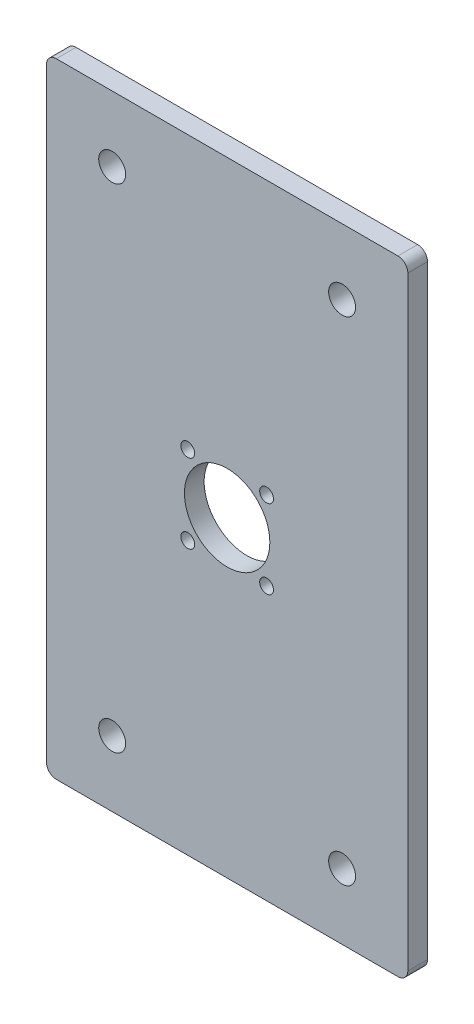
ISO-10303-21;
HEADER;
FILE_DESCRIPTION(('STEP AP214'),'2;1');
FILE_NAME('part.step','',(''),(''),'','','');
FILE_SCHEMA(('AUTOMOTIVE_DESIGN { 1 0 10303 214 1 1 1 1 }'));
ENDSEC;
DATA;
#1=APPLICATION_CONTEXT('core data for automotive mechanical design processes');
#2=APPLICATION_PROTOCOL_DEFINITION('international standard','automotive_design',2000,#1);
#3=PRODUCT_CONTEXT('',#1,'mechanical');
#4=PRODUCT('Part','Part','',(#3));
#5=PRODUCT_RELATED_PRODUCT_CATEGORY('part','',(#4));
#6=PRODUCT_DEFINITION_FORMATION('','',#4);
#7=PRODUCT_DEFINITION_CONTEXT('part definition',#1,'design');
#8=PRODUCT_DEFINITION('design','',#6,#7);
#9=PRODUCT_DEFINITION_SHAPE('','',#8);
#10=(LENGTH_UNIT() NAMED_UNIT(*) SI_UNIT(.MILLI.,.METRE.));
#11=(NAMED_UNIT(*) PLANE_ANGLE_UNIT() SI_UNIT($,.RADIAN.));
#12=(NAMED_UNIT(*) SI_UNIT($,.STERADIAN.) SOLID_ANGLE_UNIT());
#13=UNCERTAINTY_MEASURE_WITH_UNIT(LENGTH_MEASURE(1.E-05),#10,'distance_accuracy_value','');
#14=(GEOMETRIC_REPRESENTATION_CONTEXT(3) GLOBAL_UNCERTAINTY_ASSIGNED_CONTEXT((#13)) GLOBAL_UNIT_ASSIGNED_CONTEXT((#10,
#11,#12)) REPRESENTATION_CONTEXT('',''));
#15=CARTESIAN_POINT('',(0.,0.,0.));
#16=DIRECTION('',(0.,0.,1.));
#17=DIRECTION('',(1.,0.,0.));
#18=AXIS2_PLACEMENT_3D('',#15,#16,#17);
#19=CARTESIAN_POINT('',(55.,95.,6.));
#20=DIRECTION('',(-1.,0.,0.));
#21=DIRECTION('',(0.,-1.,0.));
#22=AXIS2_PLACEMENT_3D('',#19,#20,#21);
#23=PLANE('',#22);
#24=DIRECTION('',(0.,1.,0.));
#25=VECTOR('',#24,1.);
#26=CARTESIAN_POINT('',(55.,95.,6.));
#27=LINE('',#26,#25);
#28=CARTESIAN_POINT('',(55.,-92.,6.));
#29=VERTEX_POINT('',#28);
#30=CARTESIAN_POINT('',(55.,92.,6.));
#31=VERTEX_POINT('',#30);
#32=EDGE_CURVE('E130',#29,#31,#27,.T.);
#33=ORIENTED_EDGE('',*,*,#32,.F.);
#34=DIRECTION('',(0.,0.,-1.));
#35=VECTOR('',#34,1.);
#36=CARTESIAN_POINT('',(55.,-92.,6.));
#37=LINE('',#36,#35);
#38=CARTESIAN_POINT('',(55.,-92.,0.));
#39=VERTEX_POINT('',#38);
#40=EDGE_CURVE('E157',#29,#39,#37,.T.);
#41=ORIENTED_EDGE('',*,*,#40,.T.);
#42=DIRECTION('',(0.,1.,0.));
#43=VECTOR('',#42,1.);
#44=CARTESIAN_POINT('',(55.,95.,0.));
#45=LINE('',#44,#43);
#46=CARTESIAN_POINT('',(55.,92.,0.));
#47=VERTEX_POINT('',#46);
#48=EDGE_CURVE('E219',#39,#47,#45,.T.);
#49=ORIENTED_EDGE('',*,*,#48,.T.);
#50=DIRECTION('',(0.,0.,-1.));
#51=VECTOR('',#50,1.);
#52=CARTESIAN_POINT('',(55.,92.,6.));
#53=LINE('',#52,#51);
#54=EDGE_CURVE('E155',#47,#31,#53,.F.);
#55=ORIENTED_EDGE('',*,*,#54,.T.);
#56=EDGE_LOOP('',(#33,#41,#49,#55));
#57=FACE_BOUND('',#56,.T.);
#58=ADVANCED_FACE('F36',(#57),#23,.F.);
#59=CARTESIAN_POINT('',(-55.,95.,6.));
#60=DIRECTION('',(0.,-1.,0.));
#61=DIRECTION('',(0.,0.,-1.));
#62=AXIS2_PLACEMENT_3D('',#59,#60,#61);
#63=PLANE('',#62);
#64=DIRECTION('',(-1.,0.,0.));
#65=VECTOR('',#64,1.);
#66=CARTESIAN_POINT('',(-55.,95.,6.));
#67=LINE('',#66,#65);
#68=CARTESIAN_POINT('',(52.,95.,6.));
#69=VERTEX_POINT('',#68);
#70=CARTESIAN_POINT('',(-52.,95.,6.));
#71=VERTEX_POINT('',#70);
#72=EDGE_CURVE('E133',#69,#71,#67,.T.);
#73=ORIENTED_EDGE('',*,*,#72,.F.);
#74=DIRECTION('',(0.,0.,-1.));
#75=VECTOR('',#74,1.);
#76=CARTESIAN_POINT('',(52.,95.,6.));
#77=LINE('',#76,#75);
#78=CARTESIAN_POINT('',(52.,95.,0.));
#79=VERTEX_POINT('',#78);
#80=EDGE_CURVE('E11',#69,#79,#77,.T.);
#81=ORIENTED_EDGE('',*,*,#80,.T.);
#82=DIRECTION('',(-1.,0.,0.));
#83=VECTOR('',#82,1.);
#84=CARTESIAN_POINT('',(-55.,95.,0.));
#85=LINE('',#84,#83);
#86=CARTESIAN_POINT('',(-52.,95.,0.));
#87=VERTEX_POINT('',#86);
#88=EDGE_CURVE('E136',#79,#87,#85,.T.);
#89=ORIENTED_EDGE('',*,*,#88,.T.);
#90=DIRECTION('',(0.,0.,-1.));
#91=VECTOR('',#90,1.);
#92=CARTESIAN_POINT('',(-52.,95.,6.));
#93=LINE('',#92,#91);
#94=EDGE_CURVE('E45',#87,#71,#93,.F.);
#95=ORIENTED_EDGE('',*,*,#94,.T.);
#96=EDGE_LOOP('',(#73,#81,#89,#95));
#97=FACE_BOUND('',#96,.T.);
#98=ADVANCED_FACE('F229',(#97),#63,.F.);
#99=CARTESIAN_POINT('',(-55.,95.,6.));
#100=DIRECTION('',(1.,0.,0.));
#101=DIRECTION('',(0.,1.,0.));
#102=AXIS2_PLACEMENT_3D('',#99,#100,#101);
#103=PLANE('',#102);
#104=DIRECTION('',(0.,-1.,0.));
#105=VECTOR('',#104,1.);
#106=CARTESIAN_POINT('',(-55.,95.,0.));
#107=LINE('',#106,#105);
#108=CARTESIAN_POINT('',(-55.,92.,0.));
#109=VERTEX_POINT('',#108);
#110=CARTESIAN_POINT('',(-55.,-92.,0.));
#111=VERTEX_POINT('',#110);
#112=EDGE_CURVE('E131',#109,#111,#107,.T.);
#113=ORIENTED_EDGE('',*,*,#112,.T.);
#114=DIRECTION('',(0.,0.,-1.));
#115=VECTOR('',#114,1.);
#116=CARTESIAN_POINT('',(-55.,-92.,6.));
#117=LINE('',#116,#115);
#118=CARTESIAN_POINT('',(-55.,-92.,6.));
#119=VERTEX_POINT('',#118);
#120=EDGE_CURVE('E109',#111,#119,#117,.F.);
#121=ORIENTED_EDGE('',*,*,#120,.T.);
#122=DIRECTION('',(0.,-1.,0.));
#123=VECTOR('',#122,1.);
#124=CARTESIAN_POINT('',(-55.,95.,6.));
#125=LINE('',#124,#123);
#126=CARTESIAN_POINT('',(-55.,92.,6.));
#127=VERTEX_POINT('',#126);
#128=EDGE_CURVE('E222',#127,#119,#125,.T.);
#129=ORIENTED_EDGE('',*,*,#128,.F.);
#130=DIRECTION('',(0.,0.,-1.));
#131=VECTOR('',#130,1.);
#132=CARTESIAN_POINT('',(-55.,92.,6.));
#133=LINE('',#132,#131);
#134=EDGE_CURVE('E114',#127,#109,#133,.T.);
#135=ORIENTED_EDGE('',*,*,#134,.T.);
#136=EDGE_LOOP('',(#113,#121,#129,#135));
#137=FACE_BOUND('',#136,.T.);
#138=ADVANCED_FACE('F237',(#137),#103,.F.);
#139=CARTESIAN_POINT('',(-55.,-95.,6.));
#140=DIRECTION('',(0.,1.,0.));
#141=DIRECTION('',(0.,0.,1.));
#142=AXIS2_PLACEMENT_3D('',#139,#140,#141);
#143=PLANE('',#142);
#144=DIRECTION('',(1.,0.,0.));
#145=VECTOR('',#144,1.);
#146=CARTESIAN_POINT('',(-55.,-95.,6.));
#147=LINE('',#146,#145);
#148=CARTESIAN_POINT('',(-52.,-95.,6.));
#149=VERTEX_POINT('',#148);
#150=CARTESIAN_POINT('',(52.,-95.,6.));
#151=VERTEX_POINT('',#150);
#152=EDGE_CURVE('E124',#149,#151,#147,.T.);
#153=ORIENTED_EDGE('',*,*,#152,.F.);
#154=DIRECTION('',(0.,0.,-1.));
#155=VECTOR('',#154,1.);
#156=CARTESIAN_POINT('',(-52.,-95.,6.));
#157=LINE('',#156,#155);
#158=CARTESIAN_POINT('',(-52.,-95.,0.));
#159=VERTEX_POINT('',#158);
#160=EDGE_CURVE('E108',#149,#159,#157,.T.);
#161=ORIENTED_EDGE('',*,*,#160,.T.);
#162=DIRECTION('',(1.,0.,0.));
#163=VECTOR('',#162,1.);
#164=CARTESIAN_POINT('',(-55.,-95.,0.));
#165=LINE('',#164,#163);
#166=CARTESIAN_POINT('',(52.,-95.,0.));
#167=VERTEX_POINT('',#166);
#168=EDGE_CURVE('E121',#159,#167,#165,.T.);
#169=ORIENTED_EDGE('',*,*,#168,.T.);
#170=DIRECTION('',(0.,0.,-1.));
#171=VECTOR('',#170,1.);
#172=CARTESIAN_POINT('',(52.,-95.,6.));
#173=LINE('',#172,#171);
#174=EDGE_CURVE('E126',#167,#151,#173,.F.);
#175=ORIENTED_EDGE('',*,*,#174,.T.);
#176=EDGE_LOOP('',(#153,#161,#169,#175));
#177=FACE_BOUND('',#176,.T.);
#178=ADVANCED_FACE('F120',(#177),#143,.F.);
#179=CARTESIAN_POINT('',(0.,0.,6.));
#180=DIRECTION('',(0.,0.,1.));
#181=DIRECTION('',(1.,0.,0.));
#182=AXIS2_PLACEMENT_3D('',#179,#180,#181);
#183=PLANE('',#182);
#184=CARTESIAN_POINT('',(-12.,12.,6.));
#185=DIRECTION('',(0.,0.,1.));
#186=DIRECTION('',(1.,0.,0.));
#187=AXIS2_PLACEMENT_3D('',#184,#185,#186);
#188=CIRCLE('',#187,2.09999999999999);
#189=CARTESIAN_POINT('',(-9.90000000000002,12.,6.));
#190=VERTEX_POINT('',#189);
#191=EDGE_CURVE('E179',#190,#190,#188,.T.);
#192=ORIENTED_EDGE('',*,*,#191,.F.);
#193=EDGE_LOOP('',(#192));
#194=FACE_BOUND('',#193,.T.);
#195=CARTESIAN_POINT('',(12.,12.,6.));
#196=DIRECTION('',(0.,0.,1.));
#197=DIRECTION('',(1.,0.,0.));
#198=AXIS2_PLACEMENT_3D('',#195,#196,#197);
#199=CIRCLE('',#198,2.09999999999999);
#200=CARTESIAN_POINT('',(14.1,12.,6.));
#201=VERTEX_POINT('',#200);
#202=EDGE_CURVE('E168',#201,#201,#199,.T.);
#203=ORIENTED_EDGE('',*,*,#202,.F.);
#204=EDGE_LOOP('',(#203));
#205=FACE_BOUND('',#204,.T.);
#206=CARTESIAN_POINT('',(12.,-12.,6.));
#207=DIRECTION('',(0.,0.,1.));
#208=DIRECTION('',(1.,0.,0.));
#209=AXIS2_PLACEMENT_3D('',#206,#207,#208);
#210=CIRCLE('',#209,2.09999999999999);
#211=CARTESIAN_POINT('',(14.1,-12.,6.));
#212=VERTEX_POINT('',#211);
#213=EDGE_CURVE('E167',#212,#212,#210,.T.);
#214=ORIENTED_EDGE('',*,*,#213,.F.);
#215=EDGE_LOOP('',(#214));
#216=FACE_BOUND('',#215,.T.);
#217=CARTESIAN_POINT('',(-12.,-12.,6.));
#218=DIRECTION('',(0.,0.,1.));
#219=DIRECTION('',(1.,0.,0.));
#220=AXIS2_PLACEMENT_3D('',#217,#218,#219);
#221=CIRCLE('',#220,2.09999999999999);
#222=CARTESIAN_POINT('',(-9.90000000000001,-12.,6.));
#223=VERTEX_POINT('',#222);
#224=EDGE_CURVE('E164',#223,#223,#221,.T.);
#225=ORIENTED_EDGE('',*,*,#224,.F.);
#226=EDGE_LOOP('',(#225));
#227=FACE_BOUND('',#226,.T.);
#228=CARTESIAN_POINT('',(-35.,-75.,6.));
#229=DIRECTION('',(0.,0.,1.));
#230=DIRECTION('',(1.,0.,0.));
#231=AXIS2_PLACEMENT_3D('',#228,#229,#230);
#232=CIRCLE('',#231,4.10000000000001);
#233=CARTESIAN_POINT('',(-30.9,-75.,6.));
#234=VERTEX_POINT('',#233);
#235=EDGE_CURVE('E163',#234,#234,#232,.T.);
#236=ORIENTED_EDGE('',*,*,#235,.F.);
#237=EDGE_LOOP('',(#236));
#238=FACE_BOUND('',#237,.T.);
#239=CARTESIAN_POINT('',(35.,-75.,6.));
#240=DIRECTION('',(0.,0.,1.));
#241=DIRECTION('',(1.,0.,0.));
#242=AXIS2_PLACEMENT_3D('',#239,#240,#241);
#243=CIRCLE('',#242,4.1);
#244=CARTESIAN_POINT('',(39.1,-75.,6.));
#245=VERTEX_POINT('',#244);
#246=EDGE_CURVE('E195',#245,#245,#243,.T.);
#247=ORIENTED_EDGE('',*,*,#246,.F.);
#248=EDGE_LOOP('',(#247));
#249=FACE_BOUND('',#248,.T.);
#250=CARTESIAN_POINT('',(35.,75.,6.));
#251=DIRECTION('',(0.,0.,1.));
#252=DIRECTION('',(1.,0.,0.));
#253=AXIS2_PLACEMENT_3D('',#250,#251,#252);
#254=CIRCLE('',#253,4.1);
#255=CARTESIAN_POINT('',(39.1,75.,6.));
#256=VERTEX_POINT('',#255);
#257=EDGE_CURVE('E186',#256,#256,#254,.T.);
#258=ORIENTED_EDGE('',*,*,#257,.F.);
#259=EDGE_LOOP('',(#258));
#260=FACE_BOUND('',#259,.T.);
#261=CARTESIAN_POINT('',(-35.,75.,6.));
#262=DIRECTION('',(0.,0.,1.));
#263=DIRECTION('',(1.,0.,0.));
#264=AXIS2_PLACEMENT_3D('',#261,#262,#263);
#265=CIRCLE('',#264,4.10000000000001);
#266=CARTESIAN_POINT('',(-30.9,75.,6.));
#267=VERTEX_POINT('',#266);
#268=EDGE_CURVE('E194',#267,#267,#265,.T.);
#269=ORIENTED_EDGE('',*,*,#268,.F.);
#270=EDGE_LOOP('',(#269));
#271=FACE_BOUND('',#270,.T.);
#272=CARTESIAN_POINT('',(0.,0.,6.));
#273=DIRECTION('',(0.,0.,1.));
#274=DIRECTION('',(1.,0.,0.));
#275=AXIS2_PLACEMENT_3D('',#272,#273,#274);
#276=CIRCLE('',#275,13.);
#277=CARTESIAN_POINT('',(13.,0.,6.));
#278=VERTEX_POINT('',#277);
#279=EDGE_CURVE('E213',#278,#278,#276,.T.);
#280=ORIENTED_EDGE('',*,*,#279,.F.);
#281=EDGE_LOOP('',(#280));
#282=FACE_BOUND('',#281,.T.);
#283=ORIENTED_EDGE('',*,*,#128,.T.);
#284=CARTESIAN_POINT('',(-52.,-92.,6.));
#285=DIRECTION('',(0.,0.,1.));
#286=DIRECTION('',(1.,0.,0.));
#287=AXIS2_PLACEMENT_3D('',#284,#285,#286);
#288=CIRCLE('',#287,3.);
#289=EDGE_CURVE('E153',#119,#149,#288,.T.);
#290=ORIENTED_EDGE('',*,*,#289,.T.);
#291=ORIENTED_EDGE('',*,*,#152,.T.);
#292=CARTESIAN_POINT('',(52.,-92.,6.));
#293=DIRECTION('',(0.,0.,1.));
#294=DIRECTION('',(1.,0.,0.));
#295=AXIS2_PLACEMENT_3D('',#292,#293,#294);
#296=CIRCLE('',#295,3.);
#297=EDGE_CURVE('E151',#151,#29,#296,.T.);
#298=ORIENTED_EDGE('',*,*,#297,.T.);
#299=ORIENTED_EDGE('',*,*,#32,.T.);
#300=CARTESIAN_POINT('',(52.,92.,6.));
#301=DIRECTION('',(0.,0.,1.));
#302=DIRECTION('',(1.,0.,0.));
#303=AXIS2_PLACEMENT_3D('',#300,#301,#302);
#304=CIRCLE('',#303,3.);
#305=EDGE_CURVE('E59',#31,#69,#304,.T.);
#306=ORIENTED_EDGE('',*,*,#305,.T.);
#307=ORIENTED_EDGE('',*,*,#72,.T.);
#308=CARTESIAN_POINT('',(-52.,92.,6.));
#309=DIRECTION('',(0.,0.,1.));
#310=DIRECTION('',(1.,0.,0.));
#311=AXIS2_PLACEMENT_3D('',#308,#309,#310);
#312=CIRCLE('',#311,3.);
#313=EDGE_CURVE('E148',#71,#127,#312,.T.);
#314=ORIENTED_EDGE('',*,*,#313,.T.);
#315=EDGE_LOOP('',(#283,#290,#291,#298,#299,#306,#307,#314));
#316=FACE_BOUND('',#315,.T.);
#317=ADVANCED_FACE('F235',(#194,#205,#216,#227,#238,#249,#260,#271,#282,#316),#183,.T.);
#318=CARTESIAN_POINT('',(0.,0.,0.));
#319=DIRECTION('',(0.,0.,1.));
#320=DIRECTION('',(1.,0.,0.));
#321=AXIS2_PLACEMENT_3D('',#318,#319,#320);
#322=PLANE('',#321);
#323=CARTESIAN_POINT('',(-12.,12.,0.));
#324=DIRECTION('',(0.,0.,1.));
#325=DIRECTION('',(1.,0.,0.));
#326=AXIS2_PLACEMENT_3D('',#323,#324,#325);
#327=CIRCLE('',#326,2.09999999999999);
#328=CARTESIAN_POINT('',(-9.90000000000002,12.,0.));
#329=VERTEX_POINT('',#328);
#330=EDGE_CURVE('E40',#329,#329,#327,.T.);
#331=ORIENTED_EDGE('',*,*,#330,.T.);
#332=EDGE_LOOP('',(#331));
#333=FACE_BOUND('',#332,.T.);
#334=CARTESIAN_POINT('',(12.,12.,0.));
#335=DIRECTION('',(0.,0.,1.));
#336=DIRECTION('',(1.,0.,0.));
#337=AXIS2_PLACEMENT_3D('',#334,#335,#336);
#338=CIRCLE('',#337,2.09999999999999);
#339=CARTESIAN_POINT('',(14.1,12.,0.));
#340=VERTEX_POINT('',#339);
#341=EDGE_CURVE('E165',#340,#340,#338,.T.);
#342=ORIENTED_EDGE('',*,*,#341,.T.);
#343=EDGE_LOOP('',(#342));
#344=FACE_BOUND('',#343,.T.);
#345=CARTESIAN_POINT('',(12.,-12.,0.));
#346=DIRECTION('',(0.,0.,1.));
#347=DIRECTION('',(1.,0.,0.));
#348=AXIS2_PLACEMENT_3D('',#345,#346,#347);
#349=CIRCLE('',#348,2.09999999999999);
#350=CARTESIAN_POINT('',(14.1,-12.,0.));
#351=VERTEX_POINT('',#350);
#352=EDGE_CURVE('E172',#351,#351,#349,.T.);
#353=ORIENTED_EDGE('',*,*,#352,.T.);
#354=EDGE_LOOP('',(#353));
#355=FACE_BOUND('',#354,.T.);
#356=CARTESIAN_POINT('',(-12.,-12.,0.));
#357=DIRECTION('',(0.,0.,1.));
#358=DIRECTION('',(1.,0.,0.));
#359=AXIS2_PLACEMENT_3D('',#356,#357,#358);
#360=CIRCLE('',#359,2.09999999999999);
#361=CARTESIAN_POINT('',(-9.90000000000001,-12.,0.));
#362=VERTEX_POINT('',#361);
#363=EDGE_CURVE('E161',#362,#362,#360,.T.);
#364=ORIENTED_EDGE('',*,*,#363,.T.);
#365=EDGE_LOOP('',(#364));
#366=FACE_BOUND('',#365,.T.);
#367=CARTESIAN_POINT('',(-35.,-75.,0.));
#368=DIRECTION('',(0.,0.,1.));
#369=DIRECTION('',(1.,0.,0.));
#370=AXIS2_PLACEMENT_3D('',#367,#368,#369);
#371=CIRCLE('',#370,4.10000000000001);
#372=CARTESIAN_POINT('',(-30.9,-75.,0.));
#373=VERTEX_POINT('',#372);
#374=EDGE_CURVE('E198',#373,#373,#371,.F.);
#375=ORIENTED_EDGE('',*,*,#374,.F.);
#376=EDGE_LOOP('',(#375));
#377=FACE_BOUND('',#376,.T.);
#378=CARTESIAN_POINT('',(35.,-75.,0.));
#379=DIRECTION('',(0.,0.,1.));
#380=DIRECTION('',(1.,0.,0.));
#381=AXIS2_PLACEMENT_3D('',#378,#379,#380);
#382=CIRCLE('',#381,4.1);
#383=CARTESIAN_POINT('',(39.1,-75.,0.));
#384=VERTEX_POINT('',#383);
#385=EDGE_CURVE('E190',#384,#384,#382,.F.);
#386=ORIENTED_EDGE('',*,*,#385,.F.);
#387=EDGE_LOOP('',(#386));
#388=FACE_BOUND('',#387,.T.);
#389=CARTESIAN_POINT('',(35.,75.,0.));
#390=DIRECTION('',(0.,0.,1.));
#391=DIRECTION('',(1.,0.,0.));
#392=AXIS2_PLACEMENT_3D('',#389,#390,#391);
#393=CIRCLE('',#392,4.1);
#394=CARTESIAN_POINT('',(39.1,75.,0.));
#395=VERTEX_POINT('',#394);
#396=EDGE_CURVE('E189',#395,#395,#393,.F.);
#397=ORIENTED_EDGE('',*,*,#396,.F.);
#398=EDGE_LOOP('',(#397));
#399=FACE_BOUND('',#398,.T.);
#400=CARTESIAN_POINT('',(-35.,75.,0.));
#401=DIRECTION('',(0.,0.,1.));
#402=DIRECTION('',(1.,0.,0.));
#403=AXIS2_PLACEMENT_3D('',#400,#401,#402);
#404=CIRCLE('',#403,4.10000000000001);
#405=CARTESIAN_POINT('',(-30.9,75.,0.));
#406=VERTEX_POINT('',#405);
#407=EDGE_CURVE('E209',#406,#406,#404,.F.);
#408=ORIENTED_EDGE('',*,*,#407,.F.);
#409=EDGE_LOOP('',(#408));
#410=FACE_BOUND('',#409,.T.);
#411=CARTESIAN_POINT('',(0.,0.,0.));
#412=DIRECTION('',(0.,0.,1.));
#413=DIRECTION('',(1.,0.,0.));
#414=AXIS2_PLACEMENT_3D('',#411,#412,#413);
#415=CIRCLE('',#414,13.);
#416=CARTESIAN_POINT('',(13.,0.,0.));
#417=VERTEX_POINT('',#416);
#418=EDGE_CURVE('E216',#417,#417,#415,.F.);
#419=ORIENTED_EDGE('',*,*,#418,.F.);
#420=EDGE_LOOP('',(#419));
#421=FACE_BOUND('',#420,.T.);
#422=ORIENTED_EDGE('',*,*,#168,.F.);
#423=CARTESIAN_POINT('',(-52.,-92.,0.));
#424=DIRECTION('',(0.,0.,1.));
#425=DIRECTION('',(1.,0.,0.));
#426=AXIS2_PLACEMENT_3D('',#423,#424,#425);
#427=CIRCLE('',#426,3.);
#428=EDGE_CURVE('E104',#159,#111,#427,.F.);
#429=ORIENTED_EDGE('',*,*,#428,.T.);
#430=ORIENTED_EDGE('',*,*,#112,.F.);
#431=CARTESIAN_POINT('',(-52.,92.,0.));
#432=DIRECTION('',(0.,0.,1.));
#433=DIRECTION('',(1.,0.,0.));
#434=AXIS2_PLACEMENT_3D('',#431,#432,#433);
#435=CIRCLE('',#434,3.);
#436=EDGE_CURVE('E125',#109,#87,#435,.F.);
#437=ORIENTED_EDGE('',*,*,#436,.T.);
#438=ORIENTED_EDGE('',*,*,#88,.F.);
#439=CARTESIAN_POINT('',(52.,92.,0.));
#440=DIRECTION('',(0.,0.,1.));
#441=DIRECTION('',(1.,0.,0.));
#442=AXIS2_PLACEMENT_3D('',#439,#440,#441);
#443=CIRCLE('',#442,3.);
#444=EDGE_CURVE('E142',#79,#47,#443,.F.);
#445=ORIENTED_EDGE('',*,*,#444,.T.);
#446=ORIENTED_EDGE('',*,*,#48,.F.);
#447=CARTESIAN_POINT('',(52.,-92.,0.));
#448=DIRECTION('',(0.,0.,1.));
#449=DIRECTION('',(1.,0.,0.));
#450=AXIS2_PLACEMENT_3D('',#447,#448,#449);
#451=CIRCLE('',#450,3.);
#452=EDGE_CURVE('E115',#39,#167,#451,.F.);
#453=ORIENTED_EDGE('',*,*,#452,.T.);
#454=EDGE_LOOP('',(#422,#429,#430,#437,#438,#445,#446,#453));
#455=FACE_BOUND('',#454,.T.);
#456=ADVANCED_FACE('F128',(#333,#344,#355,#366,#377,#388,#399,#410,#421,#455),#322,.F.);
#457=CARTESIAN_POINT('',(0.,0.,-0.00100000000000013));
#458=DIRECTION('',(0.,0.,1.));
#459=DIRECTION('',(1.,0.,0.));
#460=AXIS2_PLACEMENT_3D('',#457,#458,#459);
#461=CYLINDRICAL_SURFACE('',#460,13.);
#462=CARTESIAN_POINT('',(13.,0.,6.));
#463=CARTESIAN_POINT('',(13.,0.,5.9375));
#464=CARTESIAN_POINT('',(13.,0.,5.875));
#465=CARTESIAN_POINT('',(13.,0.,5.75));
#466=CARTESIAN_POINT('',(13.,0.,5.6875));
#467=CARTESIAN_POINT('',(13.,0.,5.5625));
#468=CARTESIAN_POINT('',(13.,0.,5.5));
#469=CARTESIAN_POINT('',(13.,0.,5.375));
#470=CARTESIAN_POINT('',(13.,0.,5.3125));
#471=CARTESIAN_POINT('',(13.,0.,5.1875));
#472=CARTESIAN_POINT('',(13.,0.,5.125));
#473=CARTESIAN_POINT('',(13.,0.,5.));
#474=CARTESIAN_POINT('',(13.,0.,4.9375));
#475=CARTESIAN_POINT('',(13.,0.,4.8125));
#476=CARTESIAN_POINT('',(13.,0.,4.75));
#477=CARTESIAN_POINT('',(13.,0.,4.625));
#478=CARTESIAN_POINT('',(13.,0.,4.5625));
#479=CARTESIAN_POINT('',(13.,0.,4.4375));
#480=CARTESIAN_POINT('',(13.,0.,4.375));
#481=CARTESIAN_POINT('',(13.,0.,4.25));
#482=CARTESIAN_POINT('',(13.,0.,4.1875));
#483=CARTESIAN_POINT('',(13.,0.,4.0625));
#484=CARTESIAN_POINT('',(13.,0.,4.));
#485=CARTESIAN_POINT('',(13.,0.,3.875));
#486=CARTESIAN_POINT('',(13.,0.,3.8125));
#487=CARTESIAN_POINT('',(13.,0.,3.6875));
#488=CARTESIAN_POINT('',(13.,0.,3.625));
#489=CARTESIAN_POINT('',(13.,0.,3.5));
#490=CARTESIAN_POINT('',(13.,0.,3.4375));
#491=CARTESIAN_POINT('',(13.,0.,3.3125));
#492=CARTESIAN_POINT('',(13.,0.,3.25));
#493=CARTESIAN_POINT('',(13.,0.,3.125));
#494=CARTESIAN_POINT('',(13.,0.,3.0625));
#495=CARTESIAN_POINT('',(13.,0.,2.9375));
#496=CARTESIAN_POINT('',(13.,0.,2.875));
#497=CARTESIAN_POINT('',(13.,0.,2.75));
#498=CARTESIAN_POINT('',(13.,0.,2.6875));
#499=CARTESIAN_POINT('',(13.,0.,2.5625));
#500=CARTESIAN_POINT('',(13.,0.,2.5));
#501=CARTESIAN_POINT('',(13.,0.,2.375));
#502=CARTESIAN_POINT('',(13.,0.,2.3125));
#503=CARTESIAN_POINT('',(13.,0.,2.1875));
#504=CARTESIAN_POINT('',(13.,0.,2.125));
#505=CARTESIAN_POINT('',(13.,0.,2.));
#506=CARTESIAN_POINT('',(13.,0.,1.9375));
#507=CARTESIAN_POINT('',(13.,0.,1.8125));
#508=CARTESIAN_POINT('',(13.,0.,1.75));
#509=CARTESIAN_POINT('',(13.,0.,1.625));
#510=CARTESIAN_POINT('',(13.,0.,1.5625));
#511=CARTESIAN_POINT('',(13.,0.,1.4375));
#512=CARTESIAN_POINT('',(13.,0.,1.375));
#513=CARTESIAN_POINT('',(13.,0.,1.25));
#514=CARTESIAN_POINT('',(13.,0.,1.1875));
#515=CARTESIAN_POINT('',(13.,0.,1.0625));
#516=CARTESIAN_POINT('',(13.,0.,1.));
#517=CARTESIAN_POINT('',(13.,0.,0.875));
#518=CARTESIAN_POINT('',(13.,0.,0.8125));
#519=CARTESIAN_POINT('',(13.,0.,0.6875));
#520=CARTESIAN_POINT('',(13.,0.,0.625));
#521=CARTESIAN_POINT('',(13.,0.,0.5));
#522=CARTESIAN_POINT('',(13.,0.,0.4375));
#523=CARTESIAN_POINT('',(13.,0.,0.3125));
#524=CARTESIAN_POINT('',(13.,0.,0.25));
#525=CARTESIAN_POINT('',(13.,0.,0.125));
#526=CARTESIAN_POINT('',(13.,0.,0.0625000000000001));
#527=CARTESIAN_POINT('',(13.,0.,0.));
#528=B_SPLINE_CURVE_WITH_KNOTS('',3,(#462,#463,#464,#465,#466,#467,#468,#469,#470,#471,#472,
#473,#474,#475,#476,#477,#478,#479,#480,#481,#482,#483,#484,#485,#486,#487,#488,#489,#490,#491,
#492,#493,#494,#495,#496,#497,#498,#499,#500,#501,#502,#503,#504,#505,#506,#507,#508,#509,#510,
#511,#512,#513,#514,#515,#516,#517,#518,#519,#520,#521,#522,#523,#524,#525,#526,#527),
.UNSPECIFIED.,.F.,.F.,(4,2,2,2,2,2,2,2,2,2,2,2,2,2,2,2,2,2,2,2,2,2,2,2,2,2,2,2,2,2,2,2,4),(0.,
0.1875,0.375,0.5625,0.75,0.9375,1.125,1.3125,1.5,1.6875,1.875,2.0625,2.25,2.4375,2.625,2.8125,
3.,3.1875,3.375,3.5625,3.75,3.9375,4.125,4.3125,4.5,4.6875,4.875,5.0625,5.25,5.4375,5.625,
5.8125,6.),.UNSPECIFIED.);
#529=EDGE_CURVE('BSEAM298',#278,#417,#528,.T.);
#530=ORIENTED_EDGE('',*,*,#279,.T.);
#531=ORIENTED_EDGE('',*,*,#418,.T.);
#532=ORIENTED_EDGE('',*,*,#529,.T.);
#533=ORIENTED_EDGE('',*,*,#529,.F.);
#534=EDGE_LOOP('',(#530,#532,#531,#533));
#535=FACE_BOUND('',#534,.T.);
#536=ADVANCED_FACE('F298',(#535),#461,.F.);
#537=CARTESIAN_POINT('',(-35.,75.,-0.00100000000000013));
#538=DIRECTION('',(0.,0.,1.));
#539=DIRECTION('',(1.,0.,0.));
#540=AXIS2_PLACEMENT_3D('',#537,#538,#539);
#541=CYLINDRICAL_SURFACE('',#540,4.10000000000001);
#542=CARTESIAN_POINT('',(-30.9,75.,6.));
#543=CARTESIAN_POINT('',(-30.9,75.,5.9375));
#544=CARTESIAN_POINT('',(-30.9,75.,5.875));
#545=CARTESIAN_POINT('',(-30.9,75.,5.75));
#546=CARTESIAN_POINT('',(-30.9,75.,5.6875));
#547=CARTESIAN_POINT('',(-30.9,75.,5.5625));
#548=CARTESIAN_POINT('',(-30.9,75.,5.5));
#549=CARTESIAN_POINT('',(-30.9,75.,5.375));
#550=CARTESIAN_POINT('',(-30.9,75.,5.3125));
#551=CARTESIAN_POINT('',(-30.9,75.,5.1875));
#552=CARTESIAN_POINT('',(-30.9,75.,5.125));
#553=CARTESIAN_POINT('',(-30.9,75.,5.));
#554=CARTESIAN_POINT('',(-30.9,75.,4.9375));
#555=CARTESIAN_POINT('',(-30.9,75.,4.8125));
#556=CARTESIAN_POINT('',(-30.9,75.,4.75));
#557=CARTESIAN_POINT('',(-30.9,75.,4.625));
#558=CARTESIAN_POINT('',(-30.9,75.,4.5625));
#559=CARTESIAN_POINT('',(-30.9,75.,4.4375));
#560=CARTESIAN_POINT('',(-30.9,75.,4.375));
#561=CARTESIAN_POINT('',(-30.9,75.,4.25));
#562=CARTESIAN_POINT('',(-30.9,75.,4.1875));
#563=CARTESIAN_POINT('',(-30.9,75.,4.0625));
#564=CARTESIAN_POINT('',(-30.9,75.,4.));
#565=CARTESIAN_POINT('',(-30.9,75.,3.875));
#566=CARTESIAN_POINT('',(-30.9,75.,3.8125));
#567=CARTESIAN_POINT('',(-30.9,75.,3.6875));
#568=CARTESIAN_POINT('',(-30.9,75.,3.625));
#569=CARTESIAN_POINT('',(-30.9,75.,3.5));
#570=CARTESIAN_POINT('',(-30.9,75.,3.4375));
#571=CARTESIAN_POINT('',(-30.9,75.,3.3125));
#572=CARTESIAN_POINT('',(-30.9,75.,3.25));
#573=CARTESIAN_POINT('',(-30.9,75.,3.125));
#574=CARTESIAN_POINT('',(-30.9,75.,3.0625));
#575=CARTESIAN_POINT('',(-30.9,75.,2.9375));
#576=CARTESIAN_POINT('',(-30.9,75.,2.875));
#577=CARTESIAN_POINT('',(-30.9,75.,2.75));
#578=CARTESIAN_POINT('',(-30.9,75.,2.6875));
#579=CARTESIAN_POINT('',(-30.9,75.,2.5625));
#580=CARTESIAN_POINT('',(-30.9,75.,2.5));
#581=CARTESIAN_POINT('',(-30.9,75.,2.375));
#582=CARTESIAN_POINT('',(-30.9,75.,2.3125));
#583=CARTESIAN_POINT('',(-30.9,75.,2.1875));
#584=CARTESIAN_POINT('',(-30.9,75.,2.125));
#585=CARTESIAN_POINT('',(-30.9,75.,2.));
#586=CARTESIAN_POINT('',(-30.9,75.,1.9375));
#587=CARTESIAN_POINT('',(-30.9,75.,1.8125));
#588=CARTESIAN_POINT('',(-30.9,75.,1.75));
#589=CARTESIAN_POINT('',(-30.9,75.,1.625));
#590=CARTESIAN_POINT('',(-30.9,75.,1.5625));
#591=CARTESIAN_POINT('',(-30.9,75.,1.4375));
#592=CARTESIAN_POINT('',(-30.9,75.,1.375));
#593=CARTESIAN_POINT('',(-30.9,75.,1.25));
#594=CARTESIAN_POINT('',(-30.9,75.,1.1875));
#595=CARTESIAN_POINT('',(-30.9,75.,1.0625));
#596=CARTESIAN_POINT('',(-30.9,75.,1.));
#597=CARTESIAN_POINT('',(-30.9,75.,0.875));
#598=CARTESIAN_POINT('',(-30.9,75.,0.8125));
#599=CARTESIAN_POINT('',(-30.9,75.,0.6875));
#600=CARTESIAN_POINT('',(-30.9,75.,0.625));
#601=CARTESIAN_POINT('',(-30.9,75.,0.5));
#602=CARTESIAN_POINT('',(-30.9,75.,0.4375));
#603=CARTESIAN_POINT('',(-30.9,75.,0.3125));
#604=CARTESIAN_POINT('',(-30.9,75.,0.25));
#605=CARTESIAN_POINT('',(-30.9,75.,0.125));
#606=CARTESIAN_POINT('',(-30.9,75.,0.0625000000000001));
#607=CARTESIAN_POINT('',(-30.9,75.,0.));
#608=B_SPLINE_CURVE_WITH_KNOTS('',3,(#542,#543,#544,#545,#546,#547,#548,#549,#550,#551,#552,
#553,#554,#555,#556,#557,#558,#559,#560,#561,#562,#563,#564,#565,#566,#567,#568,#569,#570,#571,
#572,#573,#574,#575,#576,#577,#578,#579,#580,#581,#582,#583,#584,#585,#586,#587,#588,#589,#590,
#591,#592,#593,#594,#595,#596,#597,#598,#599,#600,#601,#602,#603,#604,#605,#606,#607),
.UNSPECIFIED.,.F.,.F.,(4,2,2,2,2,2,2,2,2,2,2,2,2,2,2,2,2,2,2,2,2,2,2,2,2,2,2,2,2,2,2,2,4),(0.,
0.1875,0.375,0.5625,0.75,0.9375,1.125,1.3125,1.5,1.6875,1.875,2.0625,2.25,2.4375,2.625,2.8125,
3.,3.1875,3.375,3.5625,3.75,3.9375,4.125,4.3125,4.5,4.6875,4.875,5.0625,5.25,5.4375,5.625,
5.8125,6.),.UNSPECIFIED.);
#609=EDGE_CURVE('BSEAM288',#267,#406,#608,.T.);
#610=ORIENTED_EDGE('',*,*,#268,.T.);
#611=ORIENTED_EDGE('',*,*,#407,.T.);
#612=ORIENTED_EDGE('',*,*,#609,.T.);
#613=ORIENTED_EDGE('',*,*,#609,.F.);
#614=EDGE_LOOP('',(#610,#612,#611,#613));
#615=FACE_BOUND('',#614,.T.);
#616=ADVANCED_FACE('F288',(#615),#541,.F.);
#617=CARTESIAN_POINT('',(35.,75.,-0.00100000000000013));
#618=DIRECTION('',(0.,0.,1.));
#619=DIRECTION('',(1.,0.,0.));
#620=AXIS2_PLACEMENT_3D('',#617,#618,#619);
#621=CYLINDRICAL_SURFACE('',#620,4.1);
#622=CARTESIAN_POINT('',(39.1,75.,6.));
#623=CARTESIAN_POINT('',(39.1,75.,5.9375));
#624=CARTESIAN_POINT('',(39.1,75.,5.875));
#625=CARTESIAN_POINT('',(39.1,75.,5.75));
#626=CARTESIAN_POINT('',(39.1,75.,5.6875));
#627=CARTESIAN_POINT('',(39.1,75.,5.5625));
#628=CARTESIAN_POINT('',(39.1,75.,5.5));
#629=CARTESIAN_POINT('',(39.1,75.,5.375));
#630=CARTESIAN_POINT('',(39.1,75.,5.3125));
#631=CARTESIAN_POINT('',(39.1,75.,5.1875));
#632=CARTESIAN_POINT('',(39.1,75.,5.125));
#633=CARTESIAN_POINT('',(39.1,75.,5.));
#634=CARTESIAN_POINT('',(39.1,75.,4.9375));
#635=CARTESIAN_POINT('',(39.1,75.,4.8125));
#636=CARTESIAN_POINT('',(39.1,75.,4.75));
#637=CARTESIAN_POINT('',(39.1,75.,4.625));
#638=CARTESIAN_POINT('',(39.1,75.,4.5625));
#639=CARTESIAN_POINT('',(39.1,75.,4.4375));
#640=CARTESIAN_POINT('',(39.1,75.,4.375));
#641=CARTESIAN_POINT('',(39.1,75.,4.25));
#642=CARTESIAN_POINT('',(39.1,75.,4.1875));
#643=CARTESIAN_POINT('',(39.1,75.,4.0625));
#644=CARTESIAN_POINT('',(39.1,75.,4.));
#645=CARTESIAN_POINT('',(39.1,75.,3.875));
#646=CARTESIAN_POINT('',(39.1,75.,3.8125));
#647=CARTESIAN_POINT('',(39.1,75.,3.6875));
#648=CARTESIAN_POINT('',(39.1,75.,3.625));
#649=CARTESIAN_POINT('',(39.1,75.,3.5));
#650=CARTESIAN_POINT('',(39.1,75.,3.4375));
#651=CARTESIAN_POINT('',(39.1,75.,3.3125));
#652=CARTESIAN_POINT('',(39.1,75.,3.25));
#653=CARTESIAN_POINT('',(39.1,75.,3.125));
#654=CARTESIAN_POINT('',(39.1,75.,3.0625));
#655=CARTESIAN_POINT('',(39.1,75.,2.9375));
#656=CARTESIAN_POINT('',(39.1,75.,2.875));
#657=CARTESIAN_POINT('',(39.1,75.,2.75));
#658=CARTESIAN_POINT('',(39.1,75.,2.6875));
#659=CARTESIAN_POINT('',(39.1,75.,2.5625));
#660=CARTESIAN_POINT('',(39.1,75.,2.5));
#661=CARTESIAN_POINT('',(39.1,75.,2.375));
#662=CARTESIAN_POINT('',(39.1,75.,2.3125));
#663=CARTESIAN_POINT('',(39.1,75.,2.1875));
#664=CARTESIAN_POINT('',(39.1,75.,2.125));
#665=CARTESIAN_POINT('',(39.1,75.,2.));
#666=CARTESIAN_POINT('',(39.1,75.,1.9375));
#667=CARTESIAN_POINT('',(39.1,75.,1.8125));
#668=CARTESIAN_POINT('',(39.1,75.,1.75));
#669=CARTESIAN_POINT('',(39.1,75.,1.625));
#670=CARTESIAN_POINT('',(39.1,75.,1.5625));
#671=CARTESIAN_POINT('',(39.1,75.,1.4375));
#672=CARTESIAN_POINT('',(39.1,75.,1.375));
#673=CARTESIAN_POINT('',(39.1,75.,1.25));
#674=CARTESIAN_POINT('',(39.1,75.,1.1875));
#675=CARTESIAN_POINT('',(39.1,75.,1.0625));
#676=CARTESIAN_POINT('',(39.1,75.,1.));
#677=CARTESIAN_POINT('',(39.1,75.,0.875));
#678=CARTESIAN_POINT('',(39.1,75.,0.8125));
#679=CARTESIAN_POINT('',(39.1,75.,0.6875));
#680=CARTESIAN_POINT('',(39.1,75.,0.625));
#681=CARTESIAN_POINT('',(39.1,75.,0.5));
#682=CARTESIAN_POINT('',(39.1,75.,0.4375));
#683=CARTESIAN_POINT('',(39.1,75.,0.3125));
#684=CARTESIAN_POINT('',(39.1,75.,0.25));
#685=CARTESIAN_POINT('',(39.1,75.,0.125));
#686=CARTESIAN_POINT('',(39.1,75.,0.0625000000000001));
#687=CARTESIAN_POINT('',(39.1,75.,0.));
#688=B_SPLINE_CURVE_WITH_KNOTS('',3,(#622,#623,#624,#625,#626,#627,#628,#629,#630,#631,#632,
#633,#634,#635,#636,#637,#638,#639,#640,#641,#642,#643,#644,#645,#646,#647,#648,#649,#650,#651,
#652,#653,#654,#655,#656,#657,#658,#659,#660,#661,#662,#663,#664,#665,#666,#667,#668,#669,#670,
#671,#672,#673,#674,#675,#676,#677,#678,#679,#680,#681,#682,#683,#684,#685,#686,#687),
.UNSPECIFIED.,.F.,.F.,(4,2,2,2,2,2,2,2,2,2,2,2,2,2,2,2,2,2,2,2,2,2,2,2,2,2,2,2,2,2,2,2,4),(0.,
0.1875,0.375,0.5625,0.75,0.9375,1.125,1.3125,1.5,1.6875,1.875,2.0625,2.25,2.4375,2.625,2.8125,
3.,3.1875,3.375,3.5625,3.75,3.9375,4.125,4.3125,4.5,4.6875,4.875,5.0625,5.25,5.4375,5.625,
5.8125,6.),.UNSPECIFIED.);
#689=EDGE_CURVE('BSEAM284',#256,#395,#688,.T.);
#690=ORIENTED_EDGE('',*,*,#257,.T.);
#691=ORIENTED_EDGE('',*,*,#396,.T.);
#692=ORIENTED_EDGE('',*,*,#689,.T.);
#693=ORIENTED_EDGE('',*,*,#689,.F.);
#694=EDGE_LOOP('',(#690,#692,#691,#693));
#695=FACE_BOUND('',#694,.T.);
#696=ADVANCED_FACE('F284',(#695),#621,.F.);
#697=CARTESIAN_POINT('',(35.,-75.,-0.00100000000000013));
#698=DIRECTION('',(0.,0.,1.));
#699=DIRECTION('',(1.,0.,0.));
#700=AXIS2_PLACEMENT_3D('',#697,#698,#699);
#701=CYLINDRICAL_SURFACE('',#700,4.1);
#702=CARTESIAN_POINT('',(39.1,-75.,6.));
#703=CARTESIAN_POINT('',(39.1,-75.,5.9375));
#704=CARTESIAN_POINT('',(39.1,-75.,5.875));
#705=CARTESIAN_POINT('',(39.1,-75.,5.75));
#706=CARTESIAN_POINT('',(39.1,-75.,5.6875));
#707=CARTESIAN_POINT('',(39.1,-75.,5.5625));
#708=CARTESIAN_POINT('',(39.1,-75.,5.5));
#709=CARTESIAN_POINT('',(39.1,-75.,5.375));
#710=CARTESIAN_POINT('',(39.1,-75.,5.3125));
#711=CARTESIAN_POINT('',(39.1,-75.,5.1875));
#712=CARTESIAN_POINT('',(39.1,-75.,5.125));
#713=CARTESIAN_POINT('',(39.1,-75.,5.));
#714=CARTESIAN_POINT('',(39.1,-75.,4.9375));
#715=CARTESIAN_POINT('',(39.1,-75.,4.8125));
#716=CARTESIAN_POINT('',(39.1,-75.,4.75));
#717=CARTESIAN_POINT('',(39.1,-75.,4.625));
#718=CARTESIAN_POINT('',(39.1,-75.,4.5625));
#719=CARTESIAN_POINT('',(39.1,-75.,4.4375));
#720=CARTESIAN_POINT('',(39.1,-75.,4.375));
#721=CARTESIAN_POINT('',(39.1,-75.,4.25));
#722=CARTESIAN_POINT('',(39.1,-75.,4.1875));
#723=CARTESIAN_POINT('',(39.1,-75.,4.0625));
#724=CARTESIAN_POINT('',(39.1,-75.,4.));
#725=CARTESIAN_POINT('',(39.1,-75.,3.875));
#726=CARTESIAN_POINT('',(39.1,-75.,3.8125));
#727=CARTESIAN_POINT('',(39.1,-75.,3.6875));
#728=CARTESIAN_POINT('',(39.1,-75.,3.625));
#729=CARTESIAN_POINT('',(39.1,-75.,3.5));
#730=CARTESIAN_POINT('',(39.1,-75.,3.4375));
#731=CARTESIAN_POINT('',(39.1,-75.,3.3125));
#732=CARTESIAN_POINT('',(39.1,-75.,3.25));
#733=CARTESIAN_POINT('',(39.1,-75.,3.125));
#734=CARTESIAN_POINT('',(39.1,-75.,3.0625));
#735=CARTESIAN_POINT('',(39.1,-75.,2.9375));
#736=CARTESIAN_POINT('',(39.1,-75.,2.875));
#737=CARTESIAN_POINT('',(39.1,-75.,2.75));
#738=CARTESIAN_POINT('',(39.1,-75.,2.6875));
#739=CARTESIAN_POINT('',(39.1,-75.,2.5625));
#740=CARTESIAN_POINT('',(39.1,-75.,2.5));
#741=CARTESIAN_POINT('',(39.1,-75.,2.375));
#742=CARTESIAN_POINT('',(39.1,-75.,2.3125));
#743=CARTESIAN_POINT('',(39.1,-75.,2.1875));
#744=CARTESIAN_POINT('',(39.1,-75.,2.125));
#745=CARTESIAN_POINT('',(39.1,-75.,2.));
#746=CARTESIAN_POINT('',(39.1,-75.,1.9375));
#747=CARTESIAN_POINT('',(39.1,-75.,1.8125));
#748=CARTESIAN_POINT('',(39.1,-75.,1.75));
#749=CARTESIAN_POINT('',(39.1,-75.,1.625));
#750=CARTESIAN_POINT('',(39.1,-75.,1.5625));
#751=CARTESIAN_POINT('',(39.1,-75.,1.4375));
#752=CARTESIAN_POINT('',(39.1,-75.,1.375));
#753=CARTESIAN_POINT('',(39.1,-75.,1.25));
#754=CARTESIAN_POINT('',(39.1,-75.,1.1875));
#755=CARTESIAN_POINT('',(39.1,-75.,1.0625));
#756=CARTESIAN_POINT('',(39.1,-75.,1.));
#757=CARTESIAN_POINT('',(39.1,-75.,0.875));
#758=CARTESIAN_POINT('',(39.1,-75.,0.8125));
#759=CARTESIAN_POINT('',(39.1,-75.,0.6875));
#760=CARTESIAN_POINT('',(39.1,-75.,0.625));
#761=CARTESIAN_POINT('',(39.1,-75.,0.5));
#762=CARTESIAN_POINT('',(39.1,-75.,0.4375));
#763=CARTESIAN_POINT('',(39.1,-75.,0.3125));
#764=CARTESIAN_POINT('',(39.1,-75.,0.25));
#765=CARTESIAN_POINT('',(39.1,-75.,0.125));
#766=CARTESIAN_POINT('',(39.1,-75.,0.0625000000000001));
#767=CARTESIAN_POINT('',(39.1,-75.,0.));
#768=B_SPLINE_CURVE_WITH_KNOTS('',3,(#702,#703,#704,#705,#706,#707,#708,#709,#710,#711,#712,
#713,#714,#715,#716,#717,#718,#719,#720,#721,#722,#723,#724,#725,#726,#727,#728,#729,#730,#731,
#732,#733,#734,#735,#736,#737,#738,#739,#740,#741,#742,#743,#744,#745,#746,#747,#748,#749,#750,
#751,#752,#753,#754,#755,#756,#757,#758,#759,#760,#761,#762,#763,#764,#765,#766,#767),
.UNSPECIFIED.,.F.,.F.,(4,2,2,2,2,2,2,2,2,2,2,2,2,2,2,2,2,2,2,2,2,2,2,2,2,2,2,2,2,2,2,2,4),(0.,
0.1875,0.375,0.5625,0.75,0.9375,1.125,1.3125,1.5,1.6875,1.875,2.0625,2.25,2.4375,2.625,2.8125,
3.,3.1875,3.375,3.5625,3.75,3.9375,4.125,4.3125,4.5,4.6875,4.875,5.0625,5.25,5.4375,5.625,
5.8125,6.),.UNSPECIFIED.);
#769=EDGE_CURVE('BSEAM287',#245,#384,#768,.T.);
#770=ORIENTED_EDGE('',*,*,#246,.T.);
#771=ORIENTED_EDGE('',*,*,#385,.T.);
#772=ORIENTED_EDGE('',*,*,#769,.T.);
#773=ORIENTED_EDGE('',*,*,#769,.F.);
#774=EDGE_LOOP('',(#770,#772,#771,#773));
#775=FACE_BOUND('',#774,.T.);
#776=ADVANCED_FACE('F287',(#775),#701,.F.);
#777=CARTESIAN_POINT('',(-35.,-75.,-0.00100000000000013));
#778=DIRECTION('',(0.,0.,1.));
#779=DIRECTION('',(1.,0.,0.));
#780=AXIS2_PLACEMENT_3D('',#777,#778,#779);
#781=CYLINDRICAL_SURFACE('',#780,4.10000000000001);
#782=CARTESIAN_POINT('',(-30.9,-75.,6.));
#783=CARTESIAN_POINT('',(-30.9,-75.,5.9375));
#784=CARTESIAN_POINT('',(-30.9,-75.,5.875));
#785=CARTESIAN_POINT('',(-30.9,-75.,5.75));
#786=CARTESIAN_POINT('',(-30.9,-75.,5.6875));
#787=CARTESIAN_POINT('',(-30.9,-75.,5.5625));
#788=CARTESIAN_POINT('',(-30.9,-75.,5.5));
#789=CARTESIAN_POINT('',(-30.9,-75.,5.375));
#790=CARTESIAN_POINT('',(-30.9,-75.,5.3125));
#791=CARTESIAN_POINT('',(-30.9,-75.,5.1875));
#792=CARTESIAN_POINT('',(-30.9,-75.,5.125));
#793=CARTESIAN_POINT('',(-30.9,-75.,5.));
#794=CARTESIAN_POINT('',(-30.9,-75.,4.9375));
#795=CARTESIAN_POINT('',(-30.9,-75.,4.8125));
#796=CARTESIAN_POINT('',(-30.9,-75.,4.75));
#797=CARTESIAN_POINT('',(-30.9,-75.,4.625));
#798=CARTESIAN_POINT('',(-30.9,-75.,4.5625));
#799=CARTESIAN_POINT('',(-30.9,-75.,4.4375));
#800=CARTESIAN_POINT('',(-30.9,-75.,4.375));
#801=CARTESIAN_POINT('',(-30.9,-75.,4.25));
#802=CARTESIAN_POINT('',(-30.9,-75.,4.1875));
#803=CARTESIAN_POINT('',(-30.9,-75.,4.0625));
#804=CARTESIAN_POINT('',(-30.9,-75.,4.));
#805=CARTESIAN_POINT('',(-30.9,-75.,3.875));
#806=CARTESIAN_POINT('',(-30.9,-75.,3.8125));
#807=CARTESIAN_POINT('',(-30.9,-75.,3.6875));
#808=CARTESIAN_POINT('',(-30.9,-75.,3.625));
#809=CARTESIAN_POINT('',(-30.9,-75.,3.5));
#810=CARTESIAN_POINT('',(-30.9,-75.,3.4375));
#811=CARTESIAN_POINT('',(-30.9,-75.,3.3125));
#812=CARTESIAN_POINT('',(-30.9,-75.,3.25));
#813=CARTESIAN_POINT('',(-30.9,-75.,3.125));
#814=CARTESIAN_POINT('',(-30.9,-75.,3.0625));
#815=CARTESIAN_POINT('',(-30.9,-75.,2.9375));
#816=CARTESIAN_POINT('',(-30.9,-75.,2.875));
#817=CARTESIAN_POINT('',(-30.9,-75.,2.75));
#818=CARTESIAN_POINT('',(-30.9,-75.,2.6875));
#819=CARTESIAN_POINT('',(-30.9,-75.,2.5625));
#820=CARTESIAN_POINT('',(-30.9,-75.,2.5));
#821=CARTESIAN_POINT('',(-30.9,-75.,2.375));
#822=CARTESIAN_POINT('',(-30.9,-75.,2.3125));
#823=CARTESIAN_POINT('',(-30.9,-75.,2.1875));
#824=CARTESIAN_POINT('',(-30.9,-75.,2.125));
#825=CARTESIAN_POINT('',(-30.9,-75.,2.));
#826=CARTESIAN_POINT('',(-30.9,-75.,1.9375));
#827=CARTESIAN_POINT('',(-30.9,-75.,1.8125));
#828=CARTESIAN_POINT('',(-30.9,-75.,1.75));
#829=CARTESIAN_POINT('',(-30.9,-75.,1.625));
#830=CARTESIAN_POINT('',(-30.9,-75.,1.5625));
#831=CARTESIAN_POINT('',(-30.9,-75.,1.4375));
#832=CARTESIAN_POINT('',(-30.9,-75.,1.375));
#833=CARTESIAN_POINT('',(-30.9,-75.,1.25));
#834=CARTESIAN_POINT('',(-30.9,-75.,1.1875));
#835=CARTESIAN_POINT('',(-30.9,-75.,1.0625));
#836=CARTESIAN_POINT('',(-30.9,-75.,1.));
#837=CARTESIAN_POINT('',(-30.9,-75.,0.875));
#838=CARTESIAN_POINT('',(-30.9,-75.,0.8125));
#839=CARTESIAN_POINT('',(-30.9,-75.,0.6875));
#840=CARTESIAN_POINT('',(-30.9,-75.,0.625));
#841=CARTESIAN_POINT('',(-30.9,-75.,0.5));
#842=CARTESIAN_POINT('',(-30.9,-75.,0.4375));
#843=CARTESIAN_POINT('',(-30.9,-75.,0.3125));
#844=CARTESIAN_POINT('',(-30.9,-75.,0.25));
#845=CARTESIAN_POINT('',(-30.9,-75.,0.125));
#846=CARTESIAN_POINT('',(-30.9,-75.,0.0625000000000001));
#847=CARTESIAN_POINT('',(-30.9,-75.,0.));
#848=B_SPLINE_CURVE_WITH_KNOTS('',3,(#782,#783,#784,#785,#786,#787,#788,#789,#790,#791,#792,
#793,#794,#795,#796,#797,#798,#799,#800,#801,#802,#803,#804,#805,#806,#807,#808,#809,#810,#811,
#812,#813,#814,#815,#816,#817,#818,#819,#820,#821,#822,#823,#824,#825,#826,#827,#828,#829,#830,
#831,#832,#833,#834,#835,#836,#837,#838,#839,#840,#841,#842,#843,#844,#845,#846,#847),
.UNSPECIFIED.,.F.,.F.,(4,2,2,2,2,2,2,2,2,2,2,2,2,2,2,2,2,2,2,2,2,2,2,2,2,2,2,2,2,2,2,2,4),(0.,
0.1875,0.375,0.5625,0.75,0.9375,1.125,1.3125,1.5,1.6875,1.875,2.0625,2.25,2.4375,2.625,2.8125,
3.,3.1875,3.375,3.5625,3.75,3.9375,4.125,4.3125,4.5,4.6875,4.875,5.0625,5.25,5.4375,5.625,
5.8125,6.),.UNSPECIFIED.);
#849=EDGE_CURVE('BSEAM256',#234,#373,#848,.T.);
#850=ORIENTED_EDGE('',*,*,#235,.T.);
#851=ORIENTED_EDGE('',*,*,#374,.T.);
#852=ORIENTED_EDGE('',*,*,#849,.T.);
#853=ORIENTED_EDGE('',*,*,#849,.F.);
#854=EDGE_LOOP('',(#850,#852,#851,#853));
#855=FACE_BOUND('',#854,.T.);
#856=ADVANCED_FACE('F256',(#855),#781,.F.);
#857=CARTESIAN_POINT('',(-52.,-92.,6.));
#858=DIRECTION('',(0.,0.,-1.));
#859=DIRECTION('',(-1.,0.,0.));
#860=AXIS2_PLACEMENT_3D('',#857,#858,#859);
#861=CYLINDRICAL_SURFACE('',#860,3.);
#862=ORIENTED_EDGE('',*,*,#289,.F.);
#863=ORIENTED_EDGE('',*,*,#120,.F.);
#864=ORIENTED_EDGE('',*,*,#428,.F.);
#865=ORIENTED_EDGE('',*,*,#160,.F.);
#866=EDGE_LOOP('',(#862,#863,#864,#865));
#867=FACE_BOUND('',#866,.T.);
#868=ADVANCED_FACE('F107',(#867),#861,.T.);
#869=CARTESIAN_POINT('',(52.,-92.,6.));
#870=DIRECTION('',(0.,0.,-1.));
#871=DIRECTION('',(-1.,0.,0.));
#872=AXIS2_PLACEMENT_3D('',#869,#870,#871);
#873=CYLINDRICAL_SURFACE('',#872,3.);
#874=ORIENTED_EDGE('',*,*,#297,.F.);
#875=ORIENTED_EDGE('',*,*,#174,.F.);
#876=ORIENTED_EDGE('',*,*,#452,.F.);
#877=ORIENTED_EDGE('',*,*,#40,.F.);
#878=EDGE_LOOP('',(#874,#875,#876,#877));
#879=FACE_BOUND('',#878,.T.);
#880=ADVANCED_FACE('F255',(#879),#873,.T.);
#881=CARTESIAN_POINT('',(52.,92.,6.));
#882=DIRECTION('',(0.,0.,-1.));
#883=DIRECTION('',(-1.,0.,0.));
#884=AXIS2_PLACEMENT_3D('',#881,#882,#883);
#885=CYLINDRICAL_SURFACE('',#884,3.);
#886=ORIENTED_EDGE('',*,*,#305,.F.);
#887=ORIENTED_EDGE('',*,*,#54,.F.);
#888=ORIENTED_EDGE('',*,*,#444,.F.);
#889=ORIENTED_EDGE('',*,*,#80,.F.);
#890=EDGE_LOOP('',(#886,#887,#888,#889));
#891=FACE_BOUND('',#890,.T.);
#892=ADVANCED_FACE('F258',(#891),#885,.T.);
#893=CARTESIAN_POINT('',(-52.,92.,6.));
#894=DIRECTION('',(0.,0.,-1.));
#895=DIRECTION('',(-1.,0.,0.));
#896=AXIS2_PLACEMENT_3D('',#893,#894,#895);
#897=CYLINDRICAL_SURFACE('',#896,3.);
#898=ORIENTED_EDGE('',*,*,#313,.F.);
#899=ORIENTED_EDGE('',*,*,#94,.F.);
#900=ORIENTED_EDGE('',*,*,#436,.F.);
#901=ORIENTED_EDGE('',*,*,#134,.F.);
#902=EDGE_LOOP('',(#898,#899,#900,#901));
#903=FACE_BOUND('',#902,.T.);
#904=ADVANCED_FACE('F38',(#903),#897,.T.);
#905=CARTESIAN_POINT('',(-12.,-12.,6.));
#906=DIRECTION('',(0.,0.,1.));
#907=DIRECTION('',(1.,0.,0.));
#908=AXIS2_PLACEMENT_3D('',#905,#906,#907);
#909=CYLINDRICAL_SURFACE('',#908,2.09999999999999);
#910=ORIENTED_EDGE('',*,*,#224,.T.);
#911=EDGE_LOOP('',(#910));
#912=FACE_BOUND('',#911,.T.);
#913=ORIENTED_EDGE('',*,*,#363,.F.);
#914=EDGE_LOOP('',(#913));
#915=FACE_BOUND('',#914,.T.);
#916=ADVANCED_FACE('F265',(#912,#915),#909,.F.);
#917=CARTESIAN_POINT('',(12.,-12.,6.));
#918=DIRECTION('',(0.,0.,1.));
#919=DIRECTION('',(1.,0.,0.));
#920=AXIS2_PLACEMENT_3D('',#917,#918,#919);
#921=CYLINDRICAL_SURFACE('',#920,2.09999999999999);
#922=ORIENTED_EDGE('',*,*,#213,.T.);
#923=EDGE_LOOP('',(#922));
#924=FACE_BOUND('',#923,.T.);
#925=ORIENTED_EDGE('',*,*,#352,.F.);
#926=EDGE_LOOP('',(#925));
#927=FACE_BOUND('',#926,.T.);
#928=ADVANCED_FACE('F272',(#924,#927),#921,.F.);
#929=CARTESIAN_POINT('',(12.,12.,6.));
#930=DIRECTION('',(0.,0.,1.));
#931=DIRECTION('',(1.,0.,0.));
#932=AXIS2_PLACEMENT_3D('',#929,#930,#931);
#933=CYLINDRICAL_SURFACE('',#932,2.09999999999999);
#934=ORIENTED_EDGE('',*,*,#202,.T.);
#935=EDGE_LOOP('',(#934));
#936=FACE_BOUND('',#935,.T.);
#937=ORIENTED_EDGE('',*,*,#341,.F.);
#938=EDGE_LOOP('',(#937));
#939=FACE_BOUND('',#938,.T.);
#940=ADVANCED_FACE('F278',(#936,#939),#933,.F.);
#941=CARTESIAN_POINT('',(-12.,12.,6.));
#942=DIRECTION('',(0.,0.,1.));
#943=DIRECTION('',(1.,0.,0.));
#944=AXIS2_PLACEMENT_3D('',#941,#942,#943);
#945=CYLINDRICAL_SURFACE('',#944,2.09999999999999);
#946=ORIENTED_EDGE('',*,*,#191,.T.);
#947=EDGE_LOOP('',(#946));
#948=FACE_BOUND('',#947,.T.);
#949=ORIENTED_EDGE('',*,*,#330,.F.);
#950=EDGE_LOOP('',(#949));
#951=FACE_BOUND('',#950,.T.);
#952=ADVANCED_FACE('F332',(#948,#951),#945,.F.);
#953=CLOSED_SHELL('',(#58,#98,#138,#178,#317,#456,#536,#616,#696,#776,#856,#868,#880,#892,#904,
#916,#928,#940,#952));
#954=MANIFOLD_SOLID_BREP('B2',#953);
#955=ADVANCED_BREP_SHAPE_REPRESENTATION('',(#18,#954),#14);
#956=SHAPE_DEFINITION_REPRESENTATION(#9,#955);
ENDSEC;
END-ISO-10303-21;
